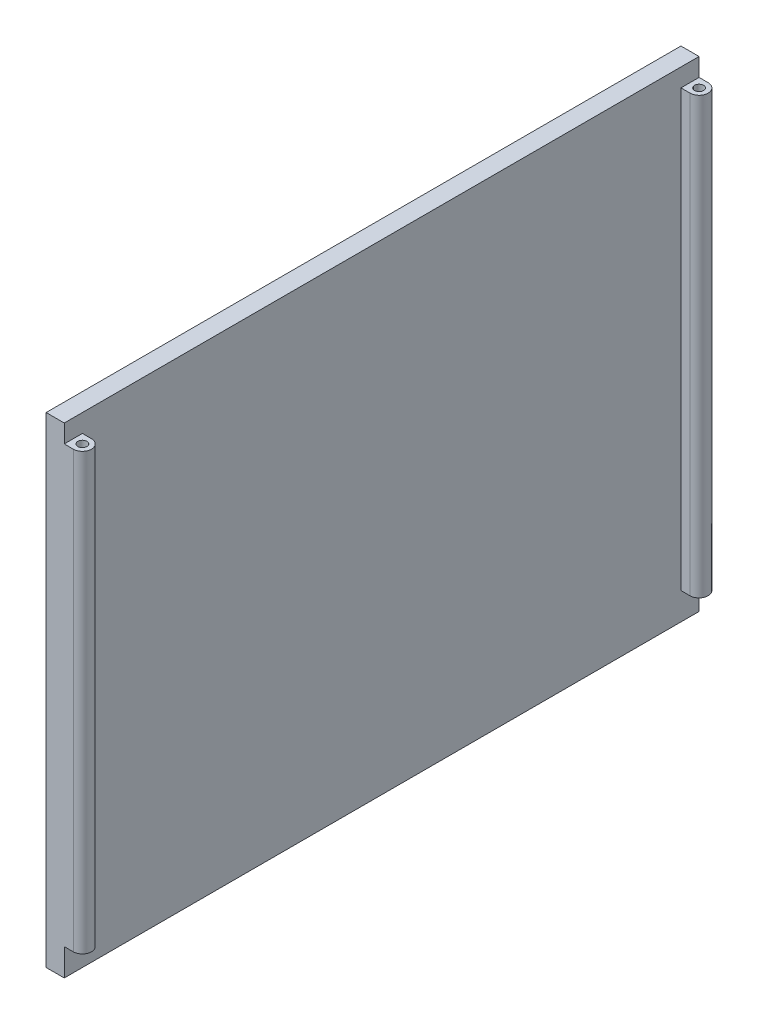
ISO-10303-21;
HEADER;
FILE_DESCRIPTION(('STEP AP214'),'2;1');
FILE_NAME('part.step','',(''),(''),'','','');
FILE_SCHEMA(('AUTOMOTIVE_DESIGN { 1 0 10303 214 1 1 1 1 }'));
ENDSEC;
DATA;
#1=APPLICATION_CONTEXT('core data for automotive mechanical design processes');
#2=APPLICATION_PROTOCOL_DEFINITION('international standard','automotive_design',2000,#1);
#3=PRODUCT_CONTEXT('',#1,'mechanical');
#4=PRODUCT('Part','Part','',(#3));
#5=PRODUCT_RELATED_PRODUCT_CATEGORY('part','',(#4));
#6=PRODUCT_DEFINITION_FORMATION('','',#4);
#7=PRODUCT_DEFINITION_CONTEXT('part definition',#1,'design');
#8=PRODUCT_DEFINITION('design','',#6,#7);
#9=PRODUCT_DEFINITION_SHAPE('','',#8);
#10=(LENGTH_UNIT() NAMED_UNIT(*) SI_UNIT(.MILLI.,.METRE.));
#11=(NAMED_UNIT(*) PLANE_ANGLE_UNIT() SI_UNIT($,.RADIAN.));
#12=(NAMED_UNIT(*) SI_UNIT($,.STERADIAN.) SOLID_ANGLE_UNIT());
#13=UNCERTAINTY_MEASURE_WITH_UNIT(LENGTH_MEASURE(1.E-05),#10,'distance_accuracy_value','');
#14=(GEOMETRIC_REPRESENTATION_CONTEXT(3) GLOBAL_UNCERTAINTY_ASSIGNED_CONTEXT((#13)) GLOBAL_UNIT_ASSIGNED_CONTEXT((#10,
#11,#12)) REPRESENTATION_CONTEXT('',''));
#15=CARTESIAN_POINT('',(0.,0.,0.));
#16=DIRECTION('',(0.,0.,1.));
#17=DIRECTION('',(1.,0.,0.));
#18=AXIS2_PLACEMENT_3D('',#15,#16,#17);
#19=CARTESIAN_POINT('',(0.,0.,0.));
#20=DIRECTION('',(1.,0.,0.));
#21=DIRECTION('',(0.,0.,-1.));
#22=AXIS2_PLACEMENT_3D('',#19,#20,#21);
#23=PLANE('',#22);
#24=DIRECTION('',(0.,-1.,0.));
#25=VECTOR('',#24,1.);
#26=CARTESIAN_POINT('',(0.,53.,35.));
#27=LINE('',#26,#25);
#28=CARTESIAN_POINT('',(0.,53.,35.));
#29=VERTEX_POINT('',#28);
#30=CARTESIAN_POINT('',(0.,0.,35.));
#31=VERTEX_POINT('',#30);
#32=EDGE_CURVE('E243',#29,#31,#27,.T.);
#33=ORIENTED_EDGE('',*,*,#32,.F.);
#34=DIRECTION('',(0.,0.,1.));
#35=VECTOR('',#34,1.);
#36=CARTESIAN_POINT('',(0.,53.,35.));
#37=LINE('',#36,#35);
#38=CARTESIAN_POINT('',(0.,53.,-35.));
#39=VERTEX_POINT('',#38);
#40=EDGE_CURVE('E261',#39,#29,#37,.T.);
#41=ORIENTED_EDGE('',*,*,#40,.F.);
#42=DIRECTION('',(0.,1.,0.));
#43=VECTOR('',#42,1.);
#44=CARTESIAN_POINT('',(0.,53.,-35.));
#45=LINE('',#44,#43);
#46=CARTESIAN_POINT('',(0.,0.,-35.));
#47=VERTEX_POINT('',#46);
#48=EDGE_CURVE('E259',#47,#39,#45,.T.);
#49=ORIENTED_EDGE('',*,*,#48,.F.);
#50=DIRECTION('',(0.,0.,-1.));
#51=VECTOR('',#50,1.);
#52=CARTESIAN_POINT('',(0.,0.,35.));
#53=LINE('',#52,#51);
#54=EDGE_CURVE('E257',#31,#47,#53,.T.);
#55=ORIENTED_EDGE('',*,*,#54,.F.);
#56=EDGE_LOOP('',(#33,#41,#49,#55));
#57=FACE_BOUND('',#56,.T.);
#58=DIRECTION('',(0.,0.,-1.));
#59=VECTOR('',#58,1.);
#60=CARTESIAN_POINT('',(0.,27.,2.5));
#61=LINE('',#60,#59);
#62=CARTESIAN_POINT('',(0.,27.,2.5));
#63=VERTEX_POINT('',#62);
#64=CARTESIAN_POINT('',(0.,27.,-2.5));
#65=VERTEX_POINT('',#64);
#66=EDGE_CURVE('E54',#63,#65,#61,.T.);
#67=ORIENTED_EDGE('',*,*,#66,.T.);
#68=DIRECTION('',(0.,1.,0.));
#69=VECTOR('',#68,1.);
#70=CARTESIAN_POINT('',(0.,29.,-2.5));
#71=LINE('',#70,#69);
#72=CARTESIAN_POINT('',(0.,29.,-2.5));
#73=VERTEX_POINT('',#72);
#74=EDGE_CURVE('E536',#65,#73,#71,.T.);
#75=ORIENTED_EDGE('',*,*,#74,.T.);
#76=DIRECTION('',(0.,0.,-1.));
#77=VECTOR('',#76,1.);
#78=CARTESIAN_POINT('',(0.,29.,2.5));
#79=LINE('',#78,#77);
#80=CARTESIAN_POINT('',(0.,29.,2.5));
#81=VERTEX_POINT('',#80);
#82=EDGE_CURVE('E172',#81,#73,#79,.T.);
#83=ORIENTED_EDGE('',*,*,#82,.F.);
#84=DIRECTION('',(0.,1.,0.));
#85=VECTOR('',#84,1.);
#86=CARTESIAN_POINT('',(0.,29.,2.5));
#87=LINE('',#86,#85);
#88=EDGE_CURVE('E49',#63,#81,#87,.T.);
#89=ORIENTED_EDGE('',*,*,#88,.F.);
#90=EDGE_LOOP('',(#67,#75,#83,#89));
#91=FACE_BOUND('',#90,.T.);
#92=ADVANCED_FACE('F34',(#57,#91),#23,.F.);
#93=CARTESIAN_POINT('',(2.,0.,0.));
#94=DIRECTION('',(1.,0.,0.));
#95=DIRECTION('',(0.,0.,-1.));
#96=AXIS2_PLACEMENT_3D('',#93,#94,#95);
#97=PLANE('',#96);
#98=DIRECTION('',(0.,0.,-1.));
#99=VECTOR('',#98,1.);
#100=CARTESIAN_POINT('',(2.,51.,33.));
#101=LINE('',#100,#99);
#102=CARTESIAN_POINT('',(2.,51.,35.));
#103=VERTEX_POINT('',#102);
#104=CARTESIAN_POINT('',(2.,51.,33.));
#105=VERTEX_POINT('',#104);
#106=EDGE_CURVE('E186',#103,#105,#101,.T.);
#107=ORIENTED_EDGE('',*,*,#106,.T.);
#108=DIRECTION('',(0.,-1.,0.));
#109=VECTOR('',#108,1.);
#110=CARTESIAN_POINT('',(2.,51.,33.));
#111=LINE('',#110,#109);
#112=CARTESIAN_POINT('',(2.,3.,33.));
#113=VERTEX_POINT('',#112);
#114=EDGE_CURVE('E203',#105,#113,#111,.T.);
#115=ORIENTED_EDGE('',*,*,#114,.T.);
#116=DIRECTION('',(0.,0.,-1.));
#117=VECTOR('',#116,1.);
#118=CARTESIAN_POINT('',(2.,3.,33.));
#119=LINE('',#118,#117);
#120=CARTESIAN_POINT('',(2.,3.,35.));
#121=VERTEX_POINT('',#120);
#122=EDGE_CURVE('E197',#121,#113,#119,.T.);
#123=ORIENTED_EDGE('',*,*,#122,.F.);
#124=DIRECTION('',(0.,-1.,0.));
#125=VECTOR('',#124,1.);
#126=CARTESIAN_POINT('',(2.,53.,35.));
#127=LINE('',#126,#125);
#128=CARTESIAN_POINT('',(2.,0.,35.));
#129=VERTEX_POINT('',#128);
#130=EDGE_CURVE('E247',#121,#129,#127,.T.);
#131=ORIENTED_EDGE('',*,*,#130,.T.);
#132=DIRECTION('',(0.,0.,-1.));
#133=VECTOR('',#132,1.);
#134=CARTESIAN_POINT('',(2.,0.,35.));
#135=LINE('',#134,#133);
#136=CARTESIAN_POINT('',(2.,0.,-35.));
#137=VERTEX_POINT('',#136);
#138=EDGE_CURVE('E246',#129,#137,#135,.T.);
#139=ORIENTED_EDGE('',*,*,#138,.T.);
#140=DIRECTION('',(0.,1.,0.));
#141=VECTOR('',#140,1.);
#142=CARTESIAN_POINT('',(2.,53.,-35.));
#143=LINE('',#142,#141);
#144=CARTESIAN_POINT('',(2.,3.,-35.));
#145=VERTEX_POINT('',#144);
#146=EDGE_CURVE('E250',#137,#145,#143,.T.);
#147=ORIENTED_EDGE('',*,*,#146,.T.);
#148=DIRECTION('',(0.,0.,1.));
#149=VECTOR('',#148,1.);
#150=CARTESIAN_POINT('',(2.,3.,-33.));
#151=LINE('',#150,#149);
#152=CARTESIAN_POINT('',(2.,3.,-33.));
#153=VERTEX_POINT('',#152);
#154=EDGE_CURVE('E232',#145,#153,#151,.T.);
#155=ORIENTED_EDGE('',*,*,#154,.T.);
#156=DIRECTION('',(0.,-1.,0.));
#157=VECTOR('',#156,1.);
#158=CARTESIAN_POINT('',(2.,51.,-33.));
#159=LINE('',#158,#157);
#160=CARTESIAN_POINT('',(2.,51.,-33.));
#161=VERTEX_POINT('',#160);
#162=EDGE_CURVE('E237',#161,#153,#159,.T.);
#163=ORIENTED_EDGE('',*,*,#162,.F.);
#164=DIRECTION('',(0.,0.,1.));
#165=VECTOR('',#164,1.);
#166=CARTESIAN_POINT('',(2.,51.,-33.));
#167=LINE('',#166,#165);
#168=CARTESIAN_POINT('',(2.,51.,-35.));
#169=VERTEX_POINT('',#168);
#170=EDGE_CURVE('E221',#169,#161,#167,.T.);
#171=ORIENTED_EDGE('',*,*,#170,.F.);
#172=CARTESIAN_POINT('',(2.,53.,-35.));
#173=VERTEX_POINT('',#172);
#174=EDGE_CURVE('E249',#169,#173,#143,.T.);
#175=ORIENTED_EDGE('',*,*,#174,.T.);
#176=DIRECTION('',(0.,0.,1.));
#177=VECTOR('',#176,1.);
#178=CARTESIAN_POINT('',(2.,53.,35.));
#179=LINE('',#178,#177);
#180=CARTESIAN_POINT('',(2.,53.,35.));
#181=VERTEX_POINT('',#180);
#182=EDGE_CURVE('E252',#173,#181,#179,.T.);
#183=ORIENTED_EDGE('',*,*,#182,.T.);
#184=EDGE_CURVE('E244',#181,#103,#127,.T.);
#185=ORIENTED_EDGE('',*,*,#184,.T.);
#186=EDGE_LOOP('',(#107,#115,#123,#131,#139,#147,#155,#163,#171,#175,#183,#185));
#187=FACE_BOUND('',#186,.T.);
#188=ADVANCED_FACE('F289',(#187),#97,.T.);
#189=CARTESIAN_POINT('',(2.,53.,35.));
#190=DIRECTION('',(0.,0.,-1.));
#191=DIRECTION('',(0.,1.,0.));
#192=AXIS2_PLACEMENT_3D('',#189,#190,#191);
#193=PLANE('',#192);
#194=ORIENTED_EDGE('',*,*,#32,.T.);
#195=DIRECTION('',(-1.,0.,0.));
#196=VECTOR('',#195,1.);
#197=CARTESIAN_POINT('',(2.,0.,35.));
#198=LINE('',#197,#196);
#199=EDGE_CURVE('E11',#129,#31,#198,.T.);
#200=ORIENTED_EDGE('',*,*,#199,.F.);
#201=ORIENTED_EDGE('',*,*,#130,.F.);
#202=DIRECTION('',(-1.,0.,0.));
#203=VECTOR('',#202,1.);
#204=CARTESIAN_POINT('',(2.,3.,35.));
#205=LINE('',#204,#203);
#206=CARTESIAN_POINT('',(3.,3.,35.));
#207=VERTEX_POINT('',#206);
#208=EDGE_CURVE('E183',#207,#121,#205,.T.);
#209=ORIENTED_EDGE('',*,*,#208,.F.);
#210=DIRECTION('',(0.,-1.,0.));
#211=VECTOR('',#210,1.);
#212=CARTESIAN_POINT('',(3.,51.,35.));
#213=LINE('',#212,#211);
#214=CARTESIAN_POINT('',(3.,51.,35.));
#215=VERTEX_POINT('',#214);
#216=EDGE_CURVE('E191',#215,#207,#213,.T.);
#217=ORIENTED_EDGE('',*,*,#216,.F.);
#218=DIRECTION('',(-1.,0.,0.));
#219=VECTOR('',#218,1.);
#220=CARTESIAN_POINT('',(2.,51.,35.));
#221=LINE('',#220,#219);
#222=EDGE_CURVE('E188',#215,#103,#221,.T.);
#223=ORIENTED_EDGE('',*,*,#222,.T.);
#224=ORIENTED_EDGE('',*,*,#184,.F.);
#225=DIRECTION('',(-1.,0.,0.));
#226=VECTOR('',#225,1.);
#227=CARTESIAN_POINT('',(2.,53.,35.));
#228=LINE('',#227,#226);
#229=EDGE_CURVE('E254',#181,#29,#228,.T.);
#230=ORIENTED_EDGE('',*,*,#229,.T.);
#231=EDGE_LOOP('',(#194,#200,#201,#209,#217,#223,#224,#230));
#232=FACE_BOUND('',#231,.T.);
#233=ADVANCED_FACE('F36',(#232),#193,.F.);
#234=CARTESIAN_POINT('',(2.,0.,35.));
#235=DIRECTION('',(0.,1.,0.));
#236=DIRECTION('',(0.,0.,1.));
#237=AXIS2_PLACEMENT_3D('',#234,#235,#236);
#238=PLANE('',#237);
#239=ORIENTED_EDGE('',*,*,#54,.T.);
#240=DIRECTION('',(-1.,0.,0.));
#241=VECTOR('',#240,1.);
#242=CARTESIAN_POINT('',(2.,0.,-35.));
#243=LINE('',#242,#241);
#244=EDGE_CURVE('E42',#137,#47,#243,.T.);
#245=ORIENTED_EDGE('',*,*,#244,.F.);
#246=ORIENTED_EDGE('',*,*,#138,.F.);
#247=ORIENTED_EDGE('',*,*,#199,.T.);
#248=EDGE_LOOP('',(#239,#245,#246,#247));
#249=FACE_BOUND('',#248,.T.);
#250=ADVANCED_FACE('F303',(#249),#238,.F.);
#251=CARTESIAN_POINT('',(2.,53.,-35.));
#252=DIRECTION('',(0.,0.,1.));
#253=DIRECTION('',(0.,-1.,0.));
#254=AXIS2_PLACEMENT_3D('',#251,#252,#253);
#255=PLANE('',#254);
#256=ORIENTED_EDGE('',*,*,#48,.T.);
#257=DIRECTION('',(-1.,0.,0.));
#258=VECTOR('',#257,1.);
#259=CARTESIAN_POINT('',(2.,53.,-35.));
#260=LINE('',#259,#258);
#261=EDGE_CURVE('E265',#173,#39,#260,.T.);
#262=ORIENTED_EDGE('',*,*,#261,.F.);
#263=ORIENTED_EDGE('',*,*,#174,.F.);
#264=DIRECTION('',(-1.,0.,0.));
#265=VECTOR('',#264,1.);
#266=CARTESIAN_POINT('',(2.,51.,-35.));
#267=LINE('',#266,#265);
#268=CARTESIAN_POINT('',(3.,51.,-35.));
#269=VERTEX_POINT('',#268);
#270=EDGE_CURVE('E217',#269,#169,#267,.T.);
#271=ORIENTED_EDGE('',*,*,#270,.F.);
#272=DIRECTION('',(0.,-1.,0.));
#273=VECTOR('',#272,1.);
#274=CARTESIAN_POINT('',(3.,51.,-35.));
#275=LINE('',#274,#273);
#276=CARTESIAN_POINT('',(3.,3.,-35.));
#277=VERTEX_POINT('',#276);
#278=EDGE_CURVE('E240',#269,#277,#275,.T.);
#279=ORIENTED_EDGE('',*,*,#278,.T.);
#280=DIRECTION('',(-1.,0.,0.));
#281=VECTOR('',#280,1.);
#282=CARTESIAN_POINT('',(2.,3.,-35.));
#283=LINE('',#282,#281);
#284=EDGE_CURVE('E229',#277,#145,#283,.T.);
#285=ORIENTED_EDGE('',*,*,#284,.T.);
#286=ORIENTED_EDGE('',*,*,#146,.F.);
#287=ORIENTED_EDGE('',*,*,#244,.T.);
#288=EDGE_LOOP('',(#256,#262,#263,#271,#279,#285,#286,#287));
#289=FACE_BOUND('',#288,.T.);
#290=ADVANCED_FACE('F272',(#289),#255,.F.);
#291=CARTESIAN_POINT('',(2.,53.,35.));
#292=DIRECTION('',(0.,-1.,0.));
#293=DIRECTION('',(0.,0.,-1.));
#294=AXIS2_PLACEMENT_3D('',#291,#292,#293);
#295=PLANE('',#294);
#296=ORIENTED_EDGE('',*,*,#40,.T.);
#297=ORIENTED_EDGE('',*,*,#229,.F.);
#298=ORIENTED_EDGE('',*,*,#182,.F.);
#299=ORIENTED_EDGE('',*,*,#261,.T.);
#300=EDGE_LOOP('',(#296,#297,#298,#299));
#301=FACE_BOUND('',#300,.T.);
#302=ADVANCED_FACE('F281',(#301),#295,.F.);
#303=CARTESIAN_POINT('',(3.,51.,-34.));
#304=DIRECTION('',(0.,1.,0.));
#305=DIRECTION('',(0.,0.,1.));
#306=AXIS2_PLACEMENT_3D('',#303,#304,#305);
#307=PLANE('',#306);
#308=CARTESIAN_POINT('',(3.,51.,-34.));
#309=DIRECTION('',(0.,1.,0.));
#310=DIRECTION('',(0.,0.,1.));
#311=AXIS2_PLACEMENT_3D('',#308,#309,#310);
#312=CIRCLE('',#311,0.999999999999997);
#313=CARTESIAN_POINT('',(3.,51.,-33.));
#314=VERTEX_POINT('',#313);
#315=EDGE_CURVE('E214',#314,#269,#312,.T.);
#316=ORIENTED_EDGE('',*,*,#315,.T.);
#317=ORIENTED_EDGE('',*,*,#270,.T.);
#318=ORIENTED_EDGE('',*,*,#170,.T.);
#319=DIRECTION('',(1.,0.,0.));
#320=VECTOR('',#319,1.);
#321=CARTESIAN_POINT('',(2.,51.,-33.));
#322=LINE('',#321,#320);
#323=EDGE_CURVE('E224',#161,#314,#322,.T.);
#324=ORIENTED_EDGE('',*,*,#323,.T.);
#325=EDGE_LOOP('',(#316,#317,#318,#324));
#326=FACE_BOUND('',#325,.T.);
#327=CARTESIAN_POINT('',(3.,51.,-34.));
#328=DIRECTION('',(0.,1.,0.));
#329=DIRECTION('',(0.,0.,1.));
#330=AXIS2_PLACEMENT_3D('',#327,#328,#329);
#331=CIRCLE('',#330,0.500000000000001);
#332=CARTESIAN_POINT('',(3.,51.,-33.5));
#333=VERTEX_POINT('',#332);
#334=EDGE_CURVE('E208',#333,#333,#331,.T.);
#335=ORIENTED_EDGE('',*,*,#334,.F.);
#336=EDGE_LOOP('',(#335));
#337=FACE_BOUND('',#336,.T.);
#338=ADVANCED_FACE('F319',(#326,#337),#307,.T.);
#339=CARTESIAN_POINT('',(3.,3.,-34.));
#340=DIRECTION('',(0.,1.,0.));
#341=DIRECTION('',(0.,0.,1.));
#342=AXIS2_PLACEMENT_3D('',#339,#340,#341);
#343=PLANE('',#342);
#344=CARTESIAN_POINT('',(3.,3.,-34.));
#345=DIRECTION('',(0.,1.,0.));
#346=DIRECTION('',(0.,0.,1.));
#347=AXIS2_PLACEMENT_3D('',#344,#345,#346);
#348=CIRCLE('',#347,0.999999999999997);
#349=CARTESIAN_POINT('',(3.,3.,-33.));
#350=VERTEX_POINT('',#349);
#351=EDGE_CURVE('E211',#350,#277,#348,.T.);
#352=ORIENTED_EDGE('',*,*,#351,.F.);
#353=DIRECTION('',(1.,0.,0.));
#354=VECTOR('',#353,1.);
#355=CARTESIAN_POINT('',(2.,3.,-33.));
#356=LINE('',#355,#354);
#357=EDGE_CURVE('E218',#153,#350,#356,.T.);
#358=ORIENTED_EDGE('',*,*,#357,.F.);
#359=ORIENTED_EDGE('',*,*,#154,.F.);
#360=ORIENTED_EDGE('',*,*,#284,.F.);
#361=EDGE_LOOP('',(#352,#358,#359,#360));
#362=FACE_BOUND('',#361,.T.);
#363=CARTESIAN_POINT('',(3.,3.,-34.));
#364=DIRECTION('',(0.,1.,0.));
#365=DIRECTION('',(0.,0.,1.));
#366=AXIS2_PLACEMENT_3D('',#363,#364,#365);
#367=CIRCLE('',#366,0.500000000000001);
#368=CARTESIAN_POINT('',(3.,3.,-33.5));
#369=VERTEX_POINT('',#368);
#370=EDGE_CURVE('E207',#369,#369,#367,.T.);
#371=ORIENTED_EDGE('',*,*,#370,.T.);
#372=EDGE_LOOP('',(#371));
#373=FACE_BOUND('',#372,.T.);
#374=ADVANCED_FACE('F309',(#362,#373),#343,.F.);
#375=CARTESIAN_POINT('',(3.,51.,-34.));
#376=DIRECTION('',(0.,-1.,0.));
#377=DIRECTION('',(0.,0.,-1.));
#378=AXIS2_PLACEMENT_3D('',#375,#376,#377);
#379=CYLINDRICAL_SURFACE('',#378,0.999999999999997);
#380=ORIENTED_EDGE('',*,*,#351,.T.);
#381=ORIENTED_EDGE('',*,*,#278,.F.);
#382=ORIENTED_EDGE('',*,*,#315,.F.);
#383=DIRECTION('',(0.,-1.,0.));
#384=VECTOR('',#383,1.);
#385=CARTESIAN_POINT('',(3.,51.,-33.));
#386=LINE('',#385,#384);
#387=EDGE_CURVE('E226',#314,#350,#386,.T.);
#388=ORIENTED_EDGE('',*,*,#387,.T.);
#389=EDGE_LOOP('',(#380,#381,#382,#388));
#390=FACE_BOUND('',#389,.T.);
#391=ADVANCED_FACE('F317',(#390),#379,.T.);
#392=CARTESIAN_POINT('',(2.,51.,-33.));
#393=DIRECTION('',(0.,0.,-1.));
#394=DIRECTION('',(-1.,0.,0.));
#395=AXIS2_PLACEMENT_3D('',#392,#393,#394);
#396=PLANE('',#395);
#397=ORIENTED_EDGE('',*,*,#357,.T.);
#398=ORIENTED_EDGE('',*,*,#387,.F.);
#399=ORIENTED_EDGE('',*,*,#323,.F.);
#400=ORIENTED_EDGE('',*,*,#162,.T.);
#401=EDGE_LOOP('',(#397,#398,#399,#400));
#402=FACE_BOUND('',#401,.T.);
#403=ADVANCED_FACE('F313',(#402),#396,.F.);
#404=CARTESIAN_POINT('',(3.,51.,-34.));
#405=DIRECTION('',(0.,-1.,0.));
#406=DIRECTION('',(0.,0.,-1.));
#407=AXIS2_PLACEMENT_3D('',#404,#405,#406);
#408=CYLINDRICAL_SURFACE('',#407,0.500000000000001);
#409=ORIENTED_EDGE('',*,*,#334,.T.);
#410=EDGE_LOOP('',(#409));
#411=FACE_BOUND('',#410,.T.);
#412=ORIENTED_EDGE('',*,*,#370,.F.);
#413=EDGE_LOOP('',(#412));
#414=FACE_BOUND('',#413,.T.);
#415=ADVANCED_FACE('F326',(#411,#414),#408,.F.);
#416=CARTESIAN_POINT('',(3.,51.,34.));
#417=DIRECTION('',(0.,-1.,0.));
#418=DIRECTION('',(0.,0.,-1.));
#419=AXIS2_PLACEMENT_3D('',#416,#417,#418);
#420=CYLINDRICAL_SURFACE('',#419,0.999999999999997);
#421=CARTESIAN_POINT('',(3.,3.,34.));
#422=DIRECTION('',(0.,-1.,0.));
#423=DIRECTION('',(0.,0.,-1.));
#424=AXIS2_PLACEMENT_3D('',#421,#422,#423);
#425=CIRCLE('',#424,0.999999999999997);
#426=CARTESIAN_POINT('',(3.,3.,33.));
#427=VERTEX_POINT('',#426);
#428=EDGE_CURVE('E177',#427,#207,#425,.T.);
#429=ORIENTED_EDGE('',*,*,#428,.F.);
#430=DIRECTION('',(0.,-1.,0.));
#431=VECTOR('',#430,1.);
#432=CARTESIAN_POINT('',(3.,51.,33.));
#433=LINE('',#432,#431);
#434=CARTESIAN_POINT('',(3.,51.,33.));
#435=VERTEX_POINT('',#434);
#436=EDGE_CURVE('E205',#435,#427,#433,.T.);
#437=ORIENTED_EDGE('',*,*,#436,.F.);
#438=CARTESIAN_POINT('',(3.,51.,34.));
#439=DIRECTION('',(0.,-1.,0.));
#440=DIRECTION('',(0.,0.,-1.));
#441=AXIS2_PLACEMENT_3D('',#438,#439,#440);
#442=CIRCLE('',#441,0.999999999999997);
#443=EDGE_CURVE('E179',#435,#215,#442,.T.);
#444=ORIENTED_EDGE('',*,*,#443,.T.);
#445=ORIENTED_EDGE('',*,*,#216,.T.);
#446=EDGE_LOOP('',(#429,#437,#444,#445));
#447=FACE_BOUND('',#446,.T.);
#448=ADVANCED_FACE('F329',(#447),#420,.T.);
#449=CARTESIAN_POINT('',(2.,51.,33.));
#450=DIRECTION('',(0.,0.,-1.));
#451=DIRECTION('',(-1.,0.,0.));
#452=AXIS2_PLACEMENT_3D('',#449,#450,#451);
#453=PLANE('',#452);
#454=DIRECTION('',(1.,0.,0.));
#455=VECTOR('',#454,1.);
#456=CARTESIAN_POINT('',(2.,3.,33.));
#457=LINE('',#456,#455);
#458=EDGE_CURVE('E194',#113,#427,#457,.T.);
#459=ORIENTED_EDGE('',*,*,#458,.F.);
#460=ORIENTED_EDGE('',*,*,#114,.F.);
#461=DIRECTION('',(1.,0.,0.));
#462=VECTOR('',#461,1.);
#463=CARTESIAN_POINT('',(2.,51.,33.));
#464=LINE('',#463,#462);
#465=EDGE_CURVE('E182',#105,#435,#464,.T.);
#466=ORIENTED_EDGE('',*,*,#465,.T.);
#467=ORIENTED_EDGE('',*,*,#436,.T.);
#468=EDGE_LOOP('',(#459,#460,#466,#467));
#469=FACE_BOUND('',#468,.T.);
#470=ADVANCED_FACE('F297',(#469),#453,.T.);
#471=CARTESIAN_POINT('',(3.,51.,34.));
#472=DIRECTION('',(0.,1.,0.));
#473=DIRECTION('',(0.,0.,-1.));
#474=AXIS2_PLACEMENT_3D('',#471,#472,#473);
#475=PLANE('',#474);
#476=CARTESIAN_POINT('',(3.,51.,34.));
#477=DIRECTION('',(0.,-1.,0.));
#478=DIRECTION('',(0.,0.,-1.));
#479=AXIS2_PLACEMENT_3D('',#476,#477,#478);
#480=CIRCLE('',#479,0.500000000000001);
#481=CARTESIAN_POINT('',(3.,51.,33.5));
#482=VERTEX_POINT('',#481);
#483=EDGE_CURVE('E170',#482,#482,#480,.T.);
#484=ORIENTED_EDGE('',*,*,#483,.T.);
#485=EDGE_LOOP('',(#484));
#486=FACE_BOUND('',#485,.T.);
#487=ORIENTED_EDGE('',*,*,#443,.F.);
#488=ORIENTED_EDGE('',*,*,#465,.F.);
#489=ORIENTED_EDGE('',*,*,#106,.F.);
#490=ORIENTED_EDGE('',*,*,#222,.F.);
#491=EDGE_LOOP('',(#487,#488,#489,#490));
#492=FACE_BOUND('',#491,.T.);
#493=ADVANCED_FACE('F294',(#486,#492),#475,.T.);
#494=CARTESIAN_POINT('',(3.,3.,34.));
#495=DIRECTION('',(0.,1.,0.));
#496=DIRECTION('',(0.,0.,-1.));
#497=AXIS2_PLACEMENT_3D('',#494,#495,#496);
#498=PLANE('',#497);
#499=CARTESIAN_POINT('',(3.,3.,34.));
#500=DIRECTION('',(0.,-1.,0.));
#501=DIRECTION('',(0.,0.,-1.));
#502=AXIS2_PLACEMENT_3D('',#499,#500,#501);
#503=CIRCLE('',#502,0.500000000000001);
#504=CARTESIAN_POINT('',(3.,3.,33.5));
#505=VERTEX_POINT('',#504);
#506=EDGE_CURVE('E167',#505,#505,#503,.T.);
#507=ORIENTED_EDGE('',*,*,#506,.F.);
#508=EDGE_LOOP('',(#507));
#509=FACE_BOUND('',#508,.T.);
#510=ORIENTED_EDGE('',*,*,#428,.T.);
#511=ORIENTED_EDGE('',*,*,#208,.T.);
#512=ORIENTED_EDGE('',*,*,#122,.T.);
#513=ORIENTED_EDGE('',*,*,#458,.T.);
#514=EDGE_LOOP('',(#510,#511,#512,#513));
#515=FACE_BOUND('',#514,.T.);
#516=ADVANCED_FACE('F302',(#509,#515),#498,.F.);
#517=CARTESIAN_POINT('',(3.,51.,34.));
#518=DIRECTION('',(0.,-1.,0.));
#519=DIRECTION('',(0.,0.,-1.));
#520=AXIS2_PLACEMENT_3D('',#517,#518,#519);
#521=CYLINDRICAL_SURFACE('',#520,0.500000000000001);
#522=ORIENTED_EDGE('',*,*,#483,.F.);
#523=EDGE_LOOP('',(#522));
#524=FACE_BOUND('',#523,.T.);
#525=ORIENTED_EDGE('',*,*,#506,.T.);
#526=EDGE_LOOP('',(#525));
#527=FACE_BOUND('',#526,.T.);
#528=ADVANCED_FACE('F445',(#524,#527),#521,.F.);
#529=CARTESIAN_POINT('',(-0.999999999999999,28.,2.5));
#530=DIRECTION('',(0.,0.,1.));
#531=DIRECTION('',(1.,0.,0.));
#532=AXIS2_PLACEMENT_3D('',#529,#530,#531);
#533=PLANE('',#532);
#534=CARTESIAN_POINT('',(-0.999999999999999,28.,2.5));
#535=DIRECTION('',(0.,0.,1.));
#536=DIRECTION('',(1.,0.,0.));
#537=AXIS2_PLACEMENT_3D('',#534,#535,#536);
#538=CIRCLE('',#537,0.999999999999999);
#539=CARTESIAN_POINT('',(-1.,29.,2.5));
#540=VERTEX_POINT('',#539);
#541=CARTESIAN_POINT('',(-0.999999999999999,27.,2.5));
#542=VERTEX_POINT('',#541);
#543=EDGE_CURVE('E152',#540,#542,#538,.T.);
#544=ORIENTED_EDGE('',*,*,#543,.T.);
#545=DIRECTION('',(1.,0.,0.));
#546=VECTOR('',#545,1.);
#547=CARTESIAN_POINT('',(0.,27.,2.5));
#548=LINE('',#547,#546);
#549=EDGE_CURVE('E145',#542,#63,#548,.T.);
#550=ORIENTED_EDGE('',*,*,#549,.T.);
#551=ORIENTED_EDGE('',*,*,#88,.T.);
#552=DIRECTION('',(-1.,0.,0.));
#553=VECTOR('',#552,1.);
#554=CARTESIAN_POINT('',(-1.,29.,2.5));
#555=LINE('',#554,#553);
#556=EDGE_CURVE('E158',#81,#540,#555,.T.);
#557=ORIENTED_EDGE('',*,*,#556,.T.);
#558=EDGE_LOOP('',(#544,#550,#551,#557));
#559=FACE_BOUND('',#558,.T.);
#560=CARTESIAN_POINT('',(-0.999999999999999,28.,2.5));
#561=DIRECTION('',(0.,0.,1.));
#562=DIRECTION('',(1.,0.,0.));
#563=AXIS2_PLACEMENT_3D('',#560,#561,#562);
#564=CIRCLE('',#563,0.500000000000001);
#565=CARTESIAN_POINT('',(-0.499999999999998,28.,2.5));
#566=VERTEX_POINT('',#565);
#567=EDGE_CURVE('E522',#566,#566,#564,.T.);
#568=ORIENTED_EDGE('',*,*,#567,.F.);
#569=EDGE_LOOP('',(#568));
#570=FACE_BOUND('',#569,.T.);
#571=ADVANCED_FACE('F155',(#559,#570),#533,.T.);
#572=CARTESIAN_POINT('',(-0.999999999999999,28.,-2.5));
#573=DIRECTION('',(0.,0.,1.));
#574=DIRECTION('',(1.,0.,0.));
#575=AXIS2_PLACEMENT_3D('',#572,#573,#574);
#576=PLANE('',#575);
#577=CARTESIAN_POINT('',(-0.999999999999999,28.,-2.5));
#578=DIRECTION('',(0.,0.,1.));
#579=DIRECTION('',(1.,0.,0.));
#580=AXIS2_PLACEMENT_3D('',#577,#578,#579);
#581=CIRCLE('',#580,0.999999999999999);
#582=CARTESIAN_POINT('',(-1.,29.,-2.5));
#583=VERTEX_POINT('',#582);
#584=CARTESIAN_POINT('',(-0.999999999999999,27.,-2.5));
#585=VERTEX_POINT('',#584);
#586=EDGE_CURVE('E166',#583,#585,#581,.T.);
#587=ORIENTED_EDGE('',*,*,#586,.F.);
#588=DIRECTION('',(-1.,0.,0.));
#589=VECTOR('',#588,1.);
#590=CARTESIAN_POINT('',(-1.,29.,-2.5));
#591=LINE('',#590,#589);
#592=EDGE_CURVE('E162',#73,#583,#591,.T.);
#593=ORIENTED_EDGE('',*,*,#592,.F.);
#594=ORIENTED_EDGE('',*,*,#74,.F.);
#595=DIRECTION('',(1.,0.,0.));
#596=VECTOR('',#595,1.);
#597=CARTESIAN_POINT('',(0.,27.,-2.5));
#598=LINE('',#597,#596);
#599=EDGE_CURVE('E534',#585,#65,#598,.T.);
#600=ORIENTED_EDGE('',*,*,#599,.F.);
#601=EDGE_LOOP('',(#587,#593,#594,#600));
#602=FACE_BOUND('',#601,.T.);
#603=CARTESIAN_POINT('',(-0.999999999999999,28.,-2.5));
#604=DIRECTION('',(0.,0.,1.));
#605=DIRECTION('',(1.,0.,0.));
#606=AXIS2_PLACEMENT_3D('',#603,#604,#605);
#607=CIRCLE('',#606,0.500000000000001);
#608=CARTESIAN_POINT('',(-0.499999999999998,28.,-2.5));
#609=VERTEX_POINT('',#608);
#610=EDGE_CURVE('E525',#609,#609,#607,.T.);
#611=ORIENTED_EDGE('',*,*,#610,.T.);
#612=EDGE_LOOP('',(#611));
#613=FACE_BOUND('',#612,.T.);
#614=ADVANCED_FACE('F466',(#602,#613),#576,.F.);
#615=CARTESIAN_POINT('',(-0.999999999999999,28.,2.5));
#616=DIRECTION('',(0.,0.,-1.));
#617=DIRECTION('',(-1.,0.,0.));
#618=AXIS2_PLACEMENT_3D('',#615,#616,#617);
#619=CYLINDRICAL_SURFACE('',#618,0.999999999999999);
#620=ORIENTED_EDGE('',*,*,#586,.T.);
#621=DIRECTION('',(0.,0.,-1.));
#622=VECTOR('',#621,1.);
#623=CARTESIAN_POINT('',(-0.999999999999999,27.,2.5));
#624=LINE('',#623,#622);
#625=EDGE_CURVE('E149',#542,#585,#624,.T.);
#626=ORIENTED_EDGE('',*,*,#625,.F.);
#627=ORIENTED_EDGE('',*,*,#543,.F.);
#628=DIRECTION('',(0.,0.,-1.));
#629=VECTOR('',#628,1.);
#630=CARTESIAN_POINT('',(-1.,29.,2.5));
#631=LINE('',#630,#629);
#632=EDGE_CURVE('E532',#540,#583,#631,.T.);
#633=ORIENTED_EDGE('',*,*,#632,.T.);
#634=EDGE_LOOP('',(#620,#626,#627,#633));
#635=FACE_BOUND('',#634,.T.);
#636=ADVANCED_FACE('F164',(#635),#619,.T.);
#637=CARTESIAN_POINT('',(0.,27.,2.5));
#638=DIRECTION('',(0.,1.,0.));
#639=DIRECTION('',(-1.,0.,0.));
#640=AXIS2_PLACEMENT_3D('',#637,#638,#639);
#641=PLANE('',#640);
#642=ORIENTED_EDGE('',*,*,#599,.T.);
#643=ORIENTED_EDGE('',*,*,#66,.F.);
#644=ORIENTED_EDGE('',*,*,#549,.F.);
#645=ORIENTED_EDGE('',*,*,#625,.T.);
#646=EDGE_LOOP('',(#642,#643,#644,#645));
#647=FACE_BOUND('',#646,.T.);
#648=ADVANCED_FACE('F147',(#647),#641,.F.);
#649=CARTESIAN_POINT('',(-1.,29.,2.5));
#650=DIRECTION('',(0.,-1.,0.));
#651=DIRECTION('',(0.,0.,-1.));
#652=AXIS2_PLACEMENT_3D('',#649,#650,#651);
#653=PLANE('',#652);
#654=ORIENTED_EDGE('',*,*,#592,.T.);
#655=ORIENTED_EDGE('',*,*,#632,.F.);
#656=ORIENTED_EDGE('',*,*,#556,.F.);
#657=ORIENTED_EDGE('',*,*,#82,.T.);
#658=EDGE_LOOP('',(#654,#655,#656,#657));
#659=FACE_BOUND('',#658,.T.);
#660=ADVANCED_FACE('F489',(#659),#653,.F.);
#661=CARTESIAN_POINT('',(-0.999999999999999,28.,2.5));
#662=DIRECTION('',(0.,0.,-1.));
#663=DIRECTION('',(-1.,0.,0.));
#664=AXIS2_PLACEMENT_3D('',#661,#662,#663);
#665=CYLINDRICAL_SURFACE('',#664,0.500000000000001);
#666=ORIENTED_EDGE('',*,*,#567,.T.);
#667=EDGE_LOOP('',(#666));
#668=FACE_BOUND('',#667,.T.);
#669=ORIENTED_EDGE('',*,*,#610,.F.);
#670=EDGE_LOOP('',(#669));
#671=FACE_BOUND('',#670,.T.);
#672=ADVANCED_FACE('F497',(#668,#671),#665,.F.);
#673=CLOSED_SHELL('',(#92,#188,#233,#250,#290,#302,#338,#374,#391,#403,#415,#448,#470,#493,#516,
#528,#571,#614,#636,#648,#660,#672));
#674=MANIFOLD_SOLID_BREP('B2',#673);
#675=ADVANCED_BREP_SHAPE_REPRESENTATION('',(#18,#674),#14);
#676=SHAPE_DEFINITION_REPRESENTATION(#9,#675);
ENDSEC;
END-ISO-10303-21;
